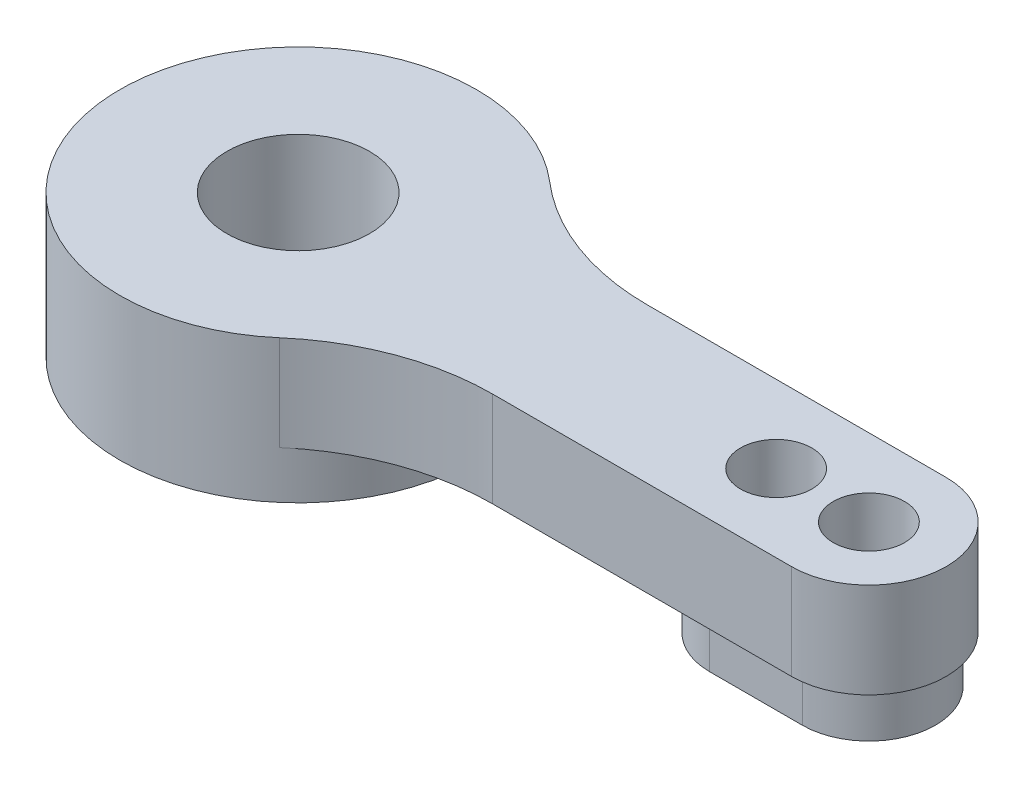
ISO-10303-21;
HEADER;
FILE_DESCRIPTION(('STEP AP214'),'2;1');
FILE_NAME('part.step','',(''),(''),'','','');
FILE_SCHEMA(('AUTOMOTIVE_DESIGN { 1 0 10303 214 1 1 1 1 }'));
ENDSEC;
DATA;
#1=APPLICATION_CONTEXT('core data for automotive mechanical design processes');
#2=APPLICATION_PROTOCOL_DEFINITION('international standard','automotive_design',2000,#1);
#3=PRODUCT_CONTEXT('',#1,'mechanical');
#4=PRODUCT('Part','Part','',(#3));
#5=PRODUCT_RELATED_PRODUCT_CATEGORY('part','',(#4));
#6=PRODUCT_DEFINITION_FORMATION('','',#4);
#7=PRODUCT_DEFINITION_CONTEXT('part definition',#1,'design');
#8=PRODUCT_DEFINITION('design','',#6,#7);
#9=PRODUCT_DEFINITION_SHAPE('','',#8);
#10=(LENGTH_UNIT() NAMED_UNIT(*) SI_UNIT(.MILLI.,.METRE.));
#11=(NAMED_UNIT(*) PLANE_ANGLE_UNIT() SI_UNIT($,.RADIAN.));
#12=(NAMED_UNIT(*) SI_UNIT($,.STERADIAN.) SOLID_ANGLE_UNIT());
#13=UNCERTAINTY_MEASURE_WITH_UNIT(LENGTH_MEASURE(1.E-05),#10,'distance_accuracy_value','');
#14=(GEOMETRIC_REPRESENTATION_CONTEXT(3) GLOBAL_UNCERTAINTY_ASSIGNED_CONTEXT((#13)) GLOBAL_UNIT_ASSIGNED_CONTEXT((#10,
#11,#12)) REPRESENTATION_CONTEXT('',''));
#15=CARTESIAN_POINT('',(0.,0.,0.));
#16=DIRECTION('',(0.,0.,1.));
#17=DIRECTION('',(1.,0.,0.));
#18=AXIS2_PLACEMENT_3D('',#15,#16,#17);
#19=CARTESIAN_POINT('',(0.,2.,0.));
#20=DIRECTION('',(0.,1.,0.));
#21=DIRECTION('',(0.,0.,1.));
#22=AXIS2_PLACEMENT_3D('',#19,#20,#21);
#23=PLANE('',#22);
#24=DIRECTION('',(1.,0.,0.));
#25=VECTOR('',#24,1.);
#26=CARTESIAN_POINT('',(0.,2.,3.25));
#27=LINE('',#26,#25);
#28=CARTESIAN_POINT('',(11.4318633651737,2.,3.25));
#29=VERTEX_POINT('',#28);
#30=CARTESIAN_POINT('',(24.,2.,3.25));
#31=VERTEX_POINT('',#30);
#32=EDGE_CURVE('E143',#29,#31,#27,.T.);
#33=ORIENTED_EDGE('',*,*,#32,.F.);
#34=CARTESIAN_POINT('',(11.4318633651737,2.,13.25));
#35=DIRECTION('',(0.,1.,0.));
#36=DIRECTION('',(0.,0.,1.));
#37=AXIS2_PLACEMENT_3D('',#34,#35,#36);
#38=CIRCLE('',#37,10.);
#39=CARTESIAN_POINT('',(4.89937001364586,2.,5.67857142857143));
#40=VERTEX_POINT('',#39);
#41=EDGE_CURVE('E11',#29,#40,#38,.T.);
#42=ORIENTED_EDGE('',*,*,#41,.T.);
#43=CARTESIAN_POINT('',(0.,2.,0.));
#44=DIRECTION('',(0.,1.,0.));
#45=DIRECTION('',(0.,0.,1.));
#46=AXIS2_PLACEMENT_3D('',#43,#44,#45);
#47=CIRCLE('',#46,7.5);
#48=CARTESIAN_POINT('',(4.89937001364586,2.,-5.67857142857143));
#49=VERTEX_POINT('',#48);
#50=EDGE_CURVE('E164',#40,#49,#47,.T.);
#51=ORIENTED_EDGE('',*,*,#50,.T.);
#52=CARTESIAN_POINT('',(11.4318633651737,2.,-13.25));
#53=DIRECTION('',(0.,1.,0.));
#54=DIRECTION('',(0.,0.,1.));
#55=AXIS2_PLACEMENT_3D('',#52,#53,#54);
#56=CIRCLE('',#55,10.);
#57=CARTESIAN_POINT('',(11.4318633651737,2.,-3.25));
#58=VERTEX_POINT('',#57);
#59=EDGE_CURVE('E187',#49,#58,#56,.T.);
#60=ORIENTED_EDGE('',*,*,#59,.T.);
#61=DIRECTION('',(-1.,0.,0.));
#62=VECTOR('',#61,1.);
#63=CARTESIAN_POINT('',(0.,2.,-3.25));
#64=LINE('',#63,#62);
#65=CARTESIAN_POINT('',(24.,2.,-3.25));
#66=VERTEX_POINT('',#65);
#67=EDGE_CURVE('E149',#66,#58,#64,.T.);
#68=ORIENTED_EDGE('',*,*,#67,.F.);
#69=CARTESIAN_POINT('',(24.,2.,0.));
#70=DIRECTION('',(0.,1.,0.));
#71=DIRECTION('',(0.,0.,1.));
#72=AXIS2_PLACEMENT_3D('',#69,#70,#71);
#73=CIRCLE('',#72,3.25);
#74=EDGE_CURVE('E145',#31,#66,#73,.T.);
#75=ORIENTED_EDGE('',*,*,#74,.F.);
#76=EDGE_LOOP('',(#33,#42,#51,#60,#68,#75));
#77=FACE_BOUND('',#76,.T.);
#78=CARTESIAN_POINT('',(24.,2.,0.));
#79=DIRECTION('',(0.,-1.,0.));
#80=DIRECTION('',(0.,0.,-1.));
#81=AXIS2_PLACEMENT_3D('',#78,#79,#80);
#82=CIRCLE('',#81,2.8);
#83=CARTESIAN_POINT('',(24.,2.,-2.8));
#84=VERTEX_POINT('',#83);
#85=CARTESIAN_POINT('',(24.,2.,2.8));
#86=VERTEX_POINT('',#85);
#87=EDGE_CURVE('E134',#84,#86,#82,.T.);
#88=ORIENTED_EDGE('',*,*,#87,.F.);
#89=DIRECTION('',(1.,0.,0.));
#90=VECTOR('',#89,1.);
#91=CARTESIAN_POINT('',(24.,2.,-2.8));
#92=LINE('',#91,#90);
#93=CARTESIAN_POINT('',(20.1,2.,-2.8));
#94=VERTEX_POINT('',#93);
#95=EDGE_CURVE('E131',#94,#84,#92,.T.);
#96=ORIENTED_EDGE('',*,*,#95,.F.);
#97=CARTESIAN_POINT('',(20.1,2.,0.));
#98=DIRECTION('',(0.,-1.,0.));
#99=DIRECTION('',(0.,0.,-1.));
#100=AXIS2_PLACEMENT_3D('',#97,#98,#99);
#101=CIRCLE('',#100,2.8);
#102=CARTESIAN_POINT('',(20.1,2.,2.8));
#103=VERTEX_POINT('',#102);
#104=EDGE_CURVE('E379',#103,#94,#101,.T.);
#105=ORIENTED_EDGE('',*,*,#104,.F.);
#106=DIRECTION('',(-1.,0.,0.));
#107=VECTOR('',#106,1.);
#108=CARTESIAN_POINT('',(24.,2.,2.8));
#109=LINE('',#108,#107);
#110=EDGE_CURVE('E377',#86,#103,#109,.T.);
#111=ORIENTED_EDGE('',*,*,#110,.F.);
#112=EDGE_LOOP('',(#88,#96,#105,#111));
#113=FACE_BOUND('',#112,.T.);
#114=ADVANCED_FACE('F34',(#77,#113),#23,.F.);
#115=CARTESIAN_POINT('',(0.,6.,0.));
#116=DIRECTION('',(0.,-1.,0.));
#117=DIRECTION('',(0.,0.,-1.));
#118=AXIS2_PLACEMENT_3D('',#115,#116,#117);
#119=CYLINDRICAL_SURFACE('',#118,7.5);
#120=CARTESIAN_POINT('',(0.,6.,0.));
#121=DIRECTION('',(0.,1.,0.));
#122=DIRECTION('',(0.,0.,1.));
#123=AXIS2_PLACEMENT_3D('',#120,#121,#122);
#124=CIRCLE('',#123,7.5);
#125=CARTESIAN_POINT('',(4.89937001364586,6.,-5.67857142857143));
#126=VERTEX_POINT('',#125);
#127=CARTESIAN_POINT('',(4.89937001364586,6.,5.67857142857143));
#128=VERTEX_POINT('',#127);
#129=EDGE_CURVE('E162',#126,#128,#124,.T.);
#130=ORIENTED_EDGE('',*,*,#129,.F.);
#131=DIRECTION('',(0.,-1.,0.));
#132=VECTOR('',#131,1.);
#133=CARTESIAN_POINT('',(4.89937001364586,6.,-5.67857142857143));
#134=LINE('',#133,#132);
#135=EDGE_CURVE('E181',#126,#49,#134,.T.);
#136=ORIENTED_EDGE('',*,*,#135,.T.);
#137=ORIENTED_EDGE('',*,*,#50,.F.);
#138=DIRECTION('',(0.,-1.,0.));
#139=VECTOR('',#138,1.);
#140=CARTESIAN_POINT('',(4.89937001364586,6.,5.67857142857143));
#141=LINE('',#140,#139);
#142=EDGE_CURVE('E168',#40,#128,#141,.F.);
#143=ORIENTED_EDGE('',*,*,#142,.T.);
#144=EDGE_LOOP('',(#130,#136,#137,#143));
#145=FACE_BOUND('',#144,.T.);
#146=CARTESIAN_POINT('',(0.,0.,0.));
#147=DIRECTION('',(0.,1.,0.));
#148=DIRECTION('',(0.,0.,1.));
#149=AXIS2_PLACEMENT_3D('',#146,#147,#148);
#150=CIRCLE('',#149,7.5);
#151=CARTESIAN_POINT('',(0.,0.,7.5));
#152=VERTEX_POINT('',#151);
#153=EDGE_CURVE('E159',#152,#152,#150,.T.);
#154=ORIENTED_EDGE('',*,*,#153,.T.);
#155=EDGE_LOOP('',(#154));
#156=FACE_BOUND('',#155,.T.);
#157=ADVANCED_FACE('F198',(#145,#156),#119,.T.);
#158=CARTESIAN_POINT('',(0.,6.,0.));
#159=DIRECTION('',(0.,1.,0.));
#160=DIRECTION('',(0.,0.,1.));
#161=AXIS2_PLACEMENT_3D('',#158,#159,#160);
#162=PLANE('',#161);
#163=CARTESIAN_POINT('',(24.,6.,0.));
#164=DIRECTION('',(0.,-1.,0.));
#165=DIRECTION('',(0.,0.,-1.));
#166=AXIS2_PLACEMENT_3D('',#163,#164,#165);
#167=CIRCLE('',#166,1.5);
#168=CARTESIAN_POINT('',(24.,6.,-1.5));
#169=VERTEX_POINT('',#168);
#170=EDGE_CURVE('E173',#169,#169,#167,.T.);
#171=ORIENTED_EDGE('',*,*,#170,.T.);
#172=EDGE_LOOP('',(#171));
#173=FACE_BOUND('',#172,.T.);
#174=CARTESIAN_POINT('',(20.1,6.,0.));
#175=DIRECTION('',(0.,-1.,0.));
#176=DIRECTION('',(0.,0.,-1.));
#177=AXIS2_PLACEMENT_3D('',#174,#175,#176);
#178=CIRCLE('',#177,1.5);
#179=CARTESIAN_POINT('',(20.1,6.,-1.5));
#180=VERTEX_POINT('',#179);
#181=EDGE_CURVE('E364',#180,#180,#178,.T.);
#182=ORIENTED_EDGE('',*,*,#181,.T.);
#183=EDGE_LOOP('',(#182));
#184=FACE_BOUND('',#183,.T.);
#185=CARTESIAN_POINT('',(0.,6.,0.));
#186=DIRECTION('',(0.,-1.,0.));
#187=DIRECTION('',(0.,0.,-1.));
#188=AXIS2_PLACEMENT_3D('',#185,#186,#187);
#189=CIRCLE('',#188,3.);
#190=CARTESIAN_POINT('',(0.,6.,-3.));
#191=VERTEX_POINT('',#190);
#192=EDGE_CURVE('E366',#191,#191,#189,.T.);
#193=ORIENTED_EDGE('',*,*,#192,.T.);
#194=EDGE_LOOP('',(#193));
#195=FACE_BOUND('',#194,.T.);
#196=DIRECTION('',(-1.,0.,0.));
#197=VECTOR('',#196,1.);
#198=CARTESIAN_POINT('',(0.,6.,-3.25));
#199=LINE('',#198,#197);
#200=CARTESIAN_POINT('',(24.,6.,-3.25));
#201=VERTEX_POINT('',#200);
#202=CARTESIAN_POINT('',(11.4318633651737,6.,-3.25));
#203=VERTEX_POINT('',#202);
#204=EDGE_CURVE('E146',#201,#203,#199,.T.);
#205=ORIENTED_EDGE('',*,*,#204,.T.);
#206=CARTESIAN_POINT('',(11.4318633651737,6.,-13.25));
#207=DIRECTION('',(0.,1.,0.));
#208=DIRECTION('',(0.,0.,1.));
#209=AXIS2_PLACEMENT_3D('',#206,#207,#208);
#210=CIRCLE('',#209,10.);
#211=EDGE_CURVE('E189',#203,#126,#210,.F.);
#212=ORIENTED_EDGE('',*,*,#211,.T.);
#213=ORIENTED_EDGE('',*,*,#129,.T.);
#214=CARTESIAN_POINT('',(11.4318633651737,6.,13.25));
#215=DIRECTION('',(0.,1.,0.));
#216=DIRECTION('',(0.,0.,1.));
#217=AXIS2_PLACEMENT_3D('',#214,#215,#216);
#218=CIRCLE('',#217,10.);
#219=CARTESIAN_POINT('',(11.4318633651737,6.,3.25));
#220=VERTEX_POINT('',#219);
#221=EDGE_CURVE('E42',#128,#220,#218,.F.);
#222=ORIENTED_EDGE('',*,*,#221,.T.);
#223=DIRECTION('',(1.,0.,0.));
#224=VECTOR('',#223,1.);
#225=CARTESIAN_POINT('',(0.,6.,3.25));
#226=LINE('',#225,#224);
#227=CARTESIAN_POINT('',(24.,6.,3.25));
#228=VERTEX_POINT('',#227);
#229=EDGE_CURVE('E135',#220,#228,#226,.T.);
#230=ORIENTED_EDGE('',*,*,#229,.T.);
#231=CARTESIAN_POINT('',(24.,6.,0.));
#232=DIRECTION('',(0.,1.,0.));
#233=DIRECTION('',(0.,0.,1.));
#234=AXIS2_PLACEMENT_3D('',#231,#232,#233);
#235=CIRCLE('',#234,3.25);
#236=EDGE_CURVE('E137',#228,#201,#235,.T.);
#237=ORIENTED_EDGE('',*,*,#236,.T.);
#238=EDGE_LOOP('',(#205,#212,#213,#222,#230,#237));
#239=FACE_BOUND('',#238,.T.);
#240=ADVANCED_FACE('F192',(#173,#184,#195,#239),#162,.T.);
#241=CARTESIAN_POINT('',(0.,0.,0.));
#242=DIRECTION('',(0.,1.,0.));
#243=DIRECTION('',(0.,0.,1.));
#244=AXIS2_PLACEMENT_3D('',#241,#242,#243);
#245=PLANE('',#244);
#246=CARTESIAN_POINT('',(0.,0.,0.));
#247=DIRECTION('',(0.,1.,0.));
#248=DIRECTION('',(0.,0.,1.));
#249=AXIS2_PLACEMENT_3D('',#246,#247,#248);
#250=CIRCLE('',#249,3.);
#251=CARTESIAN_POINT('',(0.,0.,3.));
#252=VERTEX_POINT('',#251);
#253=EDGE_CURVE('E176',#252,#252,#250,.T.);
#254=ORIENTED_EDGE('',*,*,#253,.T.);
#255=EDGE_LOOP('',(#254));
#256=FACE_BOUND('',#255,.T.);
#257=ORIENTED_EDGE('',*,*,#153,.F.);
#258=EDGE_LOOP('',(#257));
#259=FACE_BOUND('',#258,.T.);
#260=ADVANCED_FACE('F232',(#256,#259),#245,.F.);
#261=CARTESIAN_POINT('',(0.,2.,-3.25));
#262=DIRECTION('',(0.,0.,-1.));
#263=DIRECTION('',(-1.,0.,0.));
#264=AXIS2_PLACEMENT_3D('',#261,#262,#263);
#265=PLANE('',#264);
#266=ORIENTED_EDGE('',*,*,#67,.T.);
#267=DIRECTION('',(0.,-1.,0.));
#268=VECTOR('',#267,1.);
#269=CARTESIAN_POINT('',(11.4318633651737,2.,-3.25));
#270=LINE('',#269,#268);
#271=EDGE_CURVE('E184',#58,#203,#270,.F.);
#272=ORIENTED_EDGE('',*,*,#271,.T.);
#273=ORIENTED_EDGE('',*,*,#204,.F.);
#274=DIRECTION('',(0.,1.,0.));
#275=VECTOR('',#274,1.);
#276=CARTESIAN_POINT('',(24.,2.,-3.25));
#277=LINE('',#276,#275);
#278=EDGE_CURVE('E157',#66,#201,#277,.T.);
#279=ORIENTED_EDGE('',*,*,#278,.F.);
#280=EDGE_LOOP('',(#266,#272,#273,#279));
#281=FACE_BOUND('',#280,.T.);
#282=ADVANCED_FACE('F208',(#281),#265,.T.);
#283=CARTESIAN_POINT('',(0.,2.,3.25));
#284=DIRECTION('',(0.,0.,1.));
#285=DIRECTION('',(1.,0.,0.));
#286=AXIS2_PLACEMENT_3D('',#283,#284,#285);
#287=PLANE('',#286);
#288=ORIENTED_EDGE('',*,*,#229,.F.);
#289=DIRECTION('',(0.,-1.,0.));
#290=VECTOR('',#289,1.);
#291=CARTESIAN_POINT('',(11.4318633651737,2.,3.25));
#292=LINE('',#291,#290);
#293=EDGE_CURVE('E55',#220,#29,#292,.T.);
#294=ORIENTED_EDGE('',*,*,#293,.T.);
#295=ORIENTED_EDGE('',*,*,#32,.T.);
#296=DIRECTION('',(0.,1.,0.));
#297=VECTOR('',#296,1.);
#298=CARTESIAN_POINT('',(24.,2.,3.25));
#299=LINE('',#298,#297);
#300=EDGE_CURVE('E151',#31,#228,#299,.T.);
#301=ORIENTED_EDGE('',*,*,#300,.T.);
#302=EDGE_LOOP('',(#288,#294,#295,#301));
#303=FACE_BOUND('',#302,.T.);
#304=ADVANCED_FACE('F231',(#303),#287,.T.);
#305=CARTESIAN_POINT('',(24.,2.,0.));
#306=DIRECTION('',(0.,1.,0.));
#307=DIRECTION('',(0.,0.,1.));
#308=AXIS2_PLACEMENT_3D('',#305,#306,#307);
#309=CYLINDRICAL_SURFACE('',#308,3.25);
#310=ORIENTED_EDGE('',*,*,#236,.F.);
#311=ORIENTED_EDGE('',*,*,#300,.F.);
#312=ORIENTED_EDGE('',*,*,#74,.T.);
#313=ORIENTED_EDGE('',*,*,#278,.T.);
#314=EDGE_LOOP('',(#310,#311,#312,#313));
#315=FACE_BOUND('',#314,.T.);
#316=ADVANCED_FACE('F212',(#315),#309,.T.);
#317=CARTESIAN_POINT('',(24.,0.,0.));
#318=DIRECTION('',(0.,1.,0.));
#319=DIRECTION('',(0.,0.,1.));
#320=AXIS2_PLACEMENT_3D('',#317,#318,#319);
#321=CYLINDRICAL_SURFACE('',#320,2.8);
#322=ORIENTED_EDGE('',*,*,#87,.T.);
#323=DIRECTION('',(0.,1.,0.));
#324=VECTOR('',#323,1.);
#325=CARTESIAN_POINT('',(24.,0.,2.8));
#326=LINE('',#325,#324);
#327=CARTESIAN_POINT('',(24.,0.,2.8));
#328=VERTEX_POINT('',#327);
#329=EDGE_CURVE('E115',#328,#86,#326,.T.);
#330=ORIENTED_EDGE('',*,*,#329,.F.);
#331=CARTESIAN_POINT('',(24.,0.,0.));
#332=DIRECTION('',(0.,-1.,0.));
#333=DIRECTION('',(0.,0.,-1.));
#334=AXIS2_PLACEMENT_3D('',#331,#332,#333);
#335=CIRCLE('',#334,2.8);
#336=CARTESIAN_POINT('',(24.,0.,-2.8));
#337=VERTEX_POINT('',#336);
#338=EDGE_CURVE('E122',#337,#328,#335,.T.);
#339=ORIENTED_EDGE('',*,*,#338,.F.);
#340=DIRECTION('',(0.,1.,0.));
#341=VECTOR('',#340,1.);
#342=CARTESIAN_POINT('',(24.,0.,-2.8));
#343=LINE('',#342,#341);
#344=EDGE_CURVE('E375',#337,#84,#343,.T.);
#345=ORIENTED_EDGE('',*,*,#344,.T.);
#346=EDGE_LOOP('',(#322,#330,#339,#345));
#347=FACE_BOUND('',#346,.T.);
#348=ADVANCED_FACE('F133',(#347),#321,.T.);
#349=CARTESIAN_POINT('',(24.,0.,2.8));
#350=DIRECTION('',(0.,0.,-1.));
#351=DIRECTION('',(-1.,0.,0.));
#352=AXIS2_PLACEMENT_3D('',#349,#350,#351);
#353=PLANE('',#352);
#354=ORIENTED_EDGE('',*,*,#110,.T.);
#355=DIRECTION('',(0.,1.,0.));
#356=VECTOR('',#355,1.);
#357=CARTESIAN_POINT('',(20.1,0.,2.8));
#358=LINE('',#357,#356);
#359=CARTESIAN_POINT('',(20.1,0.,2.8));
#360=VERTEX_POINT('',#359);
#361=EDGE_CURVE('E118',#360,#103,#358,.T.);
#362=ORIENTED_EDGE('',*,*,#361,.F.);
#363=DIRECTION('',(-1.,0.,0.));
#364=VECTOR('',#363,1.);
#365=CARTESIAN_POINT('',(24.,0.,2.8));
#366=LINE('',#365,#364);
#367=EDGE_CURVE('E110',#328,#360,#366,.T.);
#368=ORIENTED_EDGE('',*,*,#367,.F.);
#369=ORIENTED_EDGE('',*,*,#329,.T.);
#370=EDGE_LOOP('',(#354,#362,#368,#369));
#371=FACE_BOUND('',#370,.T.);
#372=ADVANCED_FACE('F113',(#371),#353,.F.);
#373=CARTESIAN_POINT('',(20.1,0.,0.));
#374=DIRECTION('',(0.,1.,0.));
#375=DIRECTION('',(0.,0.,1.));
#376=AXIS2_PLACEMENT_3D('',#373,#374,#375);
#377=CYLINDRICAL_SURFACE('',#376,2.8);
#378=ORIENTED_EDGE('',*,*,#104,.T.);
#379=DIRECTION('',(0.,1.,0.));
#380=VECTOR('',#379,1.);
#381=CARTESIAN_POINT('',(20.1,0.,-2.8));
#382=LINE('',#381,#380);
#383=CARTESIAN_POINT('',(20.1,0.,-2.8));
#384=VERTEX_POINT('',#383);
#385=EDGE_CURVE('E139',#384,#94,#382,.T.);
#386=ORIENTED_EDGE('',*,*,#385,.F.);
#387=CARTESIAN_POINT('',(20.1,0.,0.));
#388=DIRECTION('',(0.,-1.,0.));
#389=DIRECTION('',(0.,0.,-1.));
#390=AXIS2_PLACEMENT_3D('',#387,#388,#389);
#391=CIRCLE('',#390,2.8);
#392=EDGE_CURVE('E121',#360,#384,#391,.T.);
#393=ORIENTED_EDGE('',*,*,#392,.F.);
#394=ORIENTED_EDGE('',*,*,#361,.T.);
#395=EDGE_LOOP('',(#378,#386,#393,#394));
#396=FACE_BOUND('',#395,.T.);
#397=ADVANCED_FACE('F267',(#396),#377,.T.);
#398=CARTESIAN_POINT('',(24.,0.,-2.8));
#399=DIRECTION('',(0.,0.,1.));
#400=DIRECTION('',(1.,0.,0.));
#401=AXIS2_PLACEMENT_3D('',#398,#399,#400);
#402=PLANE('',#401);
#403=ORIENTED_EDGE('',*,*,#95,.T.);
#404=ORIENTED_EDGE('',*,*,#344,.F.);
#405=DIRECTION('',(1.,0.,0.));
#406=VECTOR('',#405,1.);
#407=CARTESIAN_POINT('',(24.,0.,-2.8));
#408=LINE('',#407,#406);
#409=EDGE_CURVE('E127',#384,#337,#408,.T.);
#410=ORIENTED_EDGE('',*,*,#409,.F.);
#411=ORIENTED_EDGE('',*,*,#385,.T.);
#412=EDGE_LOOP('',(#403,#404,#410,#411));
#413=FACE_BOUND('',#412,.T.);
#414=ADVANCED_FACE('F263',(#413),#402,.F.);
#415=CARTESIAN_POINT('',(24.,0.,0.));
#416=DIRECTION('',(0.,-1.,0.));
#417=DIRECTION('',(0.,0.,-1.));
#418=AXIS2_PLACEMENT_3D('',#415,#416,#417);
#419=PLANE('',#418);
#420=CARTESIAN_POINT('',(24.,0.,0.));
#421=DIRECTION('',(0.,-1.,0.));
#422=DIRECTION('',(0.,0.,-1.));
#423=AXIS2_PLACEMENT_3D('',#420,#421,#422);
#424=CIRCLE('',#423,1.5);
#425=CARTESIAN_POINT('',(24.,0.,-1.5));
#426=VERTEX_POINT('',#425);
#427=EDGE_CURVE('E172',#426,#426,#424,.T.);
#428=ORIENTED_EDGE('',*,*,#427,.F.);
#429=EDGE_LOOP('',(#428));
#430=FACE_BOUND('',#429,.T.);
#431=CARTESIAN_POINT('',(20.1,0.,0.));
#432=DIRECTION('',(0.,-1.,0.));
#433=DIRECTION('',(0.,0.,-1.));
#434=AXIS2_PLACEMENT_3D('',#431,#432,#433);
#435=CIRCLE('',#434,1.5);
#436=CARTESIAN_POINT('',(20.1,0.,-1.5));
#437=VERTEX_POINT('',#436);
#438=EDGE_CURVE('E169',#437,#437,#435,.T.);
#439=ORIENTED_EDGE('',*,*,#438,.F.);
#440=EDGE_LOOP('',(#439));
#441=FACE_BOUND('',#440,.T.);
#442=ORIENTED_EDGE('',*,*,#338,.T.);
#443=ORIENTED_EDGE('',*,*,#367,.T.);
#444=ORIENTED_EDGE('',*,*,#392,.T.);
#445=ORIENTED_EDGE('',*,*,#409,.T.);
#446=EDGE_LOOP('',(#442,#443,#444,#445));
#447=FACE_BOUND('',#446,.T.);
#448=ADVANCED_FACE('F125',(#430,#441,#447),#419,.T.);
#449=CARTESIAN_POINT('',(20.1,6.,0.));
#450=DIRECTION('',(0.,-1.,0.));
#451=DIRECTION('',(0.,0.,-1.));
#452=AXIS2_PLACEMENT_3D('',#449,#450,#451);
#453=CYLINDRICAL_SURFACE('',#452,1.5);
#454=ORIENTED_EDGE('',*,*,#438,.T.);
#455=EDGE_LOOP('',(#454));
#456=FACE_BOUND('',#455,.T.);
#457=ORIENTED_EDGE('',*,*,#181,.F.);
#458=EDGE_LOOP('',(#457));
#459=FACE_BOUND('',#458,.T.);
#460=ADVANCED_FACE('F255',(#456,#459),#453,.F.);
#461=CARTESIAN_POINT('',(24.,6.,0.));
#462=DIRECTION('',(0.,-1.,0.));
#463=DIRECTION('',(0.,0.,-1.));
#464=AXIS2_PLACEMENT_3D('',#461,#462,#463);
#465=CYLINDRICAL_SURFACE('',#464,1.5);
#466=ORIENTED_EDGE('',*,*,#427,.T.);
#467=EDGE_LOOP('',(#466));
#468=FACE_BOUND('',#467,.T.);
#469=ORIENTED_EDGE('',*,*,#170,.F.);
#470=EDGE_LOOP('',(#469));
#471=FACE_BOUND('',#470,.T.);
#472=ADVANCED_FACE('F249',(#468,#471),#465,.F.);
#473=CARTESIAN_POINT('',(0.,6.,0.));
#474=DIRECTION('',(0.,-1.,0.));
#475=DIRECTION('',(0.,0.,-1.));
#476=AXIS2_PLACEMENT_3D('',#473,#474,#475);
#477=CYLINDRICAL_SURFACE('',#476,3.);
#478=ORIENTED_EDGE('',*,*,#192,.F.);
#479=EDGE_LOOP('',(#478));
#480=FACE_BOUND('',#479,.T.);
#481=ORIENTED_EDGE('',*,*,#253,.F.);
#482=EDGE_LOOP('',(#481));
#483=FACE_BOUND('',#482,.T.);
#484=ADVANCED_FACE('F219',(#480,#483),#477,.F.);
#485=CARTESIAN_POINT('',(11.4318633651737,6.,-13.25));
#486=DIRECTION('',(0.,-1.,0.));
#487=DIRECTION('',(0.,0.,-1.));
#488=AXIS2_PLACEMENT_3D('',#485,#486,#487);
#489=CYLINDRICAL_SURFACE('',#488,10.);
#490=ORIENTED_EDGE('',*,*,#211,.F.);
#491=ORIENTED_EDGE('',*,*,#271,.F.);
#492=ORIENTED_EDGE('',*,*,#59,.F.);
#493=ORIENTED_EDGE('',*,*,#135,.F.);
#494=EDGE_LOOP('',(#490,#491,#492,#493));
#495=FACE_BOUND('',#494,.T.);
#496=ADVANCED_FACE('F202',(#495),#489,.F.);
#497=CARTESIAN_POINT('',(11.4318633651737,6.,13.25));
#498=DIRECTION('',(0.,-1.,0.));
#499=DIRECTION('',(0.,0.,-1.));
#500=AXIS2_PLACEMENT_3D('',#497,#498,#499);
#501=CYLINDRICAL_SURFACE('',#500,10.);
#502=ORIENTED_EDGE('',*,*,#41,.F.);
#503=ORIENTED_EDGE('',*,*,#293,.F.);
#504=ORIENTED_EDGE('',*,*,#221,.F.);
#505=ORIENTED_EDGE('',*,*,#142,.F.);
#506=EDGE_LOOP('',(#502,#503,#504,#505));
#507=FACE_BOUND('',#506,.T.);
#508=ADVANCED_FACE('F36',(#507),#501,.F.);
#509=CLOSED_SHELL('',(#114,#157,#240,#260,#282,#304,#316,#348,#372,#397,#414,#448,#460,#472,
#484,#496,#508));
#510=MANIFOLD_SOLID_BREP('B2',#509);
#511=ADVANCED_BREP_SHAPE_REPRESENTATION('',(#18,#510),#14);
#512=SHAPE_DEFINITION_REPRESENTATION(#9,#511);
ENDSEC;
END-ISO-10303-21;
